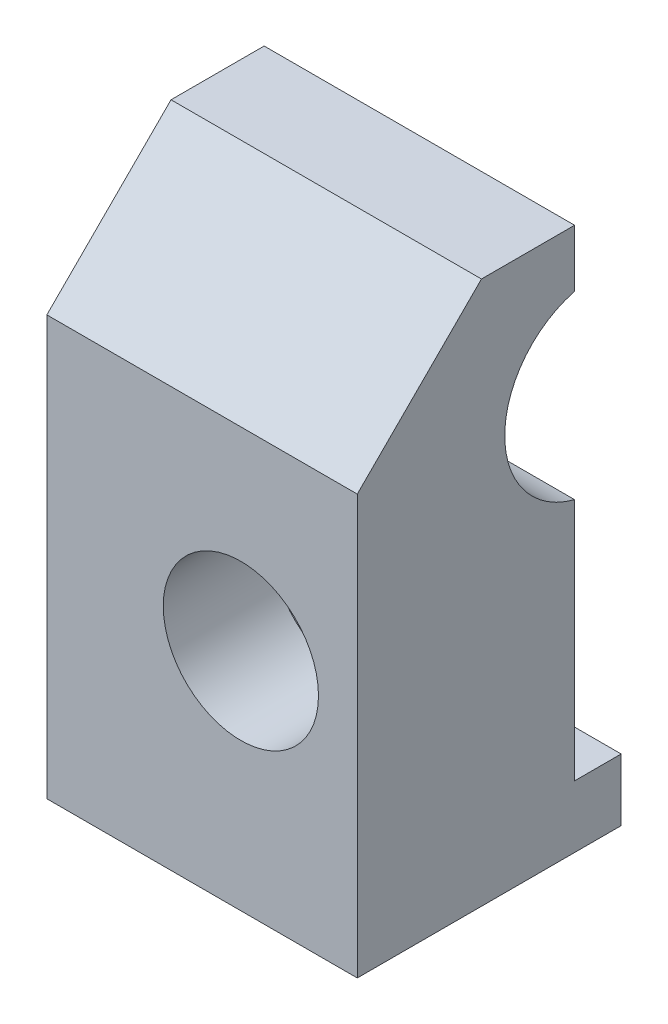
ISO-10303-21;
HEADER;
FILE_DESCRIPTION(('STEP AP214'),'2;1');
FILE_NAME('part.step','',(''),(''),'','','');
FILE_SCHEMA(('AUTOMOTIVE_DESIGN { 1 0 10303 214 1 1 1 1 }'));
ENDSEC;
DATA;
#1=APPLICATION_CONTEXT('core data for automotive mechanical design processes');
#2=APPLICATION_PROTOCOL_DEFINITION('international standard','automotive_design',2000,#1);
#3=PRODUCT_CONTEXT('',#1,'mechanical');
#4=PRODUCT('Part','Part','',(#3));
#5=PRODUCT_RELATED_PRODUCT_CATEGORY('part','',(#4));
#6=PRODUCT_DEFINITION_FORMATION('','',#4);
#7=PRODUCT_DEFINITION_CONTEXT('part definition',#1,'design');
#8=PRODUCT_DEFINITION('design','',#6,#7);
#9=PRODUCT_DEFINITION_SHAPE('','',#8);
#10=(LENGTH_UNIT() NAMED_UNIT(*) SI_UNIT(.MILLI.,.METRE.));
#11=(NAMED_UNIT(*) PLANE_ANGLE_UNIT() SI_UNIT($,.RADIAN.));
#12=(NAMED_UNIT(*) SI_UNIT($,.STERADIAN.) SOLID_ANGLE_UNIT());
#13=UNCERTAINTY_MEASURE_WITH_UNIT(LENGTH_MEASURE(1.E-05),#10,'distance_accuracy_value','');
#14=(GEOMETRIC_REPRESENTATION_CONTEXT(3) GLOBAL_UNCERTAINTY_ASSIGNED_CONTEXT((#13)) GLOBAL_UNIT_ASSIGNED_CONTEXT((#10,
#11,#12)) REPRESENTATION_CONTEXT('',''));
#15=CARTESIAN_POINT('',(0.,0.,0.));
#16=DIRECTION('',(0.,0.,1.));
#17=DIRECTION('',(1.,0.,0.));
#18=AXIS2_PLACEMENT_3D('',#15,#16,#17);
#19=CARTESIAN_POINT('',(22.5,-30.,-30.000025));
#20=DIRECTION('',(0.,0.,1.));
#21=DIRECTION('',(1.,0.,0.));
#22=AXIS2_PLACEMENT_3D('',#19,#20,#21);
#23=CYLINDRICAL_SURFACE('',#22,2.25);
#24=CARTESIAN_POINT('',(22.5,-30.,16.5));
#25=DIRECTION('',(0.,0.,-1.));
#26=DIRECTION('',(-1.,0.,0.));
#27=AXIS2_PLACEMENT_3D('',#24,#25,#26);
#28=CIRCLE('',#27,2.25);
#29=CARTESIAN_POINT('',(20.25,-30.,16.5));
#30=VERTEX_POINT('',#29);
#31=EDGE_CURVE('E139',#30,#30,#28,.T.);
#32=ORIENTED_EDGE('',*,*,#31,.T.);
#33=EDGE_LOOP('',(#32));
#34=FACE_BOUND('',#33,.T.);
#35=CARTESIAN_POINT('',(22.5,-30.,23.5));
#36=DIRECTION('',(0.,0.,1.));
#37=DIRECTION('',(1.,0.,0.));
#38=AXIS2_PLACEMENT_3D('',#35,#36,#37);
#39=CIRCLE('',#38,2.25);
#40=CARTESIAN_POINT('',(24.75,-30.,23.5));
#41=VERTEX_POINT('',#40);
#42=EDGE_CURVE('E182',#41,#41,#39,.F.);
#43=ORIENTED_EDGE('',*,*,#42,.F.);
#44=EDGE_LOOP('',(#43));
#45=FACE_BOUND('',#44,.T.);
#46=ADVANCED_FACE('F39',(#34,#45),#23,.F.);
#47=CARTESIAN_POINT('',(10.,-19.,15.));
#48=DIRECTION('',(1.,0.,0.));
#49=DIRECTION('',(0.,1.,0.));
#50=AXIS2_PLACEMENT_3D('',#47,#48,#49);
#51=CYLINDRICAL_SURFACE('',#50,6.);
#52=CARTESIAN_POINT('',(30.,-19.,15.));
#53=DIRECTION('',(-1.,0.,0.));
#54=DIRECTION('',(0.,1.,0.));
#55=AXIS2_PLACEMENT_3D('',#52,#53,#54);
#56=CIRCLE('',#55,6.);
#57=CARTESIAN_POINT('',(30.,-24.8094750193111,16.5));
#58=VERTEX_POINT('',#57);
#59=CARTESIAN_POINT('',(30.,-13.1905249806889,16.5));
#60=VERTEX_POINT('',#59);
#61=EDGE_CURVE('E155',#58,#60,#56,.T.);
#62=ORIENTED_EDGE('',*,*,#61,.F.);
#63=DIRECTION('',(1.,0.,0.));
#64=VECTOR('',#63,1.);
#65=CARTESIAN_POINT('',(10.,-24.8094750193111,16.5));
#66=LINE('',#65,#64);
#67=CARTESIAN_POINT('',(10.,-24.8094750193111,16.5));
#68=VERTEX_POINT('',#67);
#69=EDGE_CURVE('E132',#68,#58,#66,.T.);
#70=ORIENTED_EDGE('',*,*,#69,.F.);
#71=CARTESIAN_POINT('',(10.,-19.,15.));
#72=DIRECTION('',(-1.,0.,0.));
#73=DIRECTION('',(0.,1.,0.));
#74=AXIS2_PLACEMENT_3D('',#71,#72,#73);
#75=CIRCLE('',#74,6.);
#76=CARTESIAN_POINT('',(10.,-13.1905249806889,16.5));
#77=VERTEX_POINT('',#76);
#78=EDGE_CURVE('E126',#68,#77,#75,.T.);
#79=ORIENTED_EDGE('',*,*,#78,.T.);
#80=DIRECTION('',(1.,0.,0.));
#81=VECTOR('',#80,1.);
#82=CARTESIAN_POINT('',(10.,-13.1905249806889,16.5));
#83=LINE('',#82,#81);
#84=EDGE_CURVE('E108',#77,#60,#83,.T.);
#85=ORIENTED_EDGE('',*,*,#84,.T.);
#86=EDGE_LOOP('',(#62,#70,#79,#85));
#87=FACE_BOUND('',#86,.T.);
#88=ADVANCED_FACE('F131',(#87),#51,.F.);
#89=CARTESIAN_POINT('',(10.,-40.5,16.5));
#90=DIRECTION('',(0.,0.,-1.));
#91=DIRECTION('',(-1.,0.,0.));
#92=AXIS2_PLACEMENT_3D('',#89,#90,#91);
#93=PLANE('',#92);
#94=ORIENTED_EDGE('',*,*,#31,.F.);
#95=EDGE_LOOP('',(#94));
#96=FACE_BOUND('',#95,.T.);
#97=DIRECTION('',(0.,1.,0.));
#98=VECTOR('',#97,1.);
#99=CARTESIAN_POINT('',(30.,-40.5,16.5));
#100=LINE('',#99,#98);
#101=CARTESIAN_POINT('',(30.,-40.5,16.5));
#102=VERTEX_POINT('',#101);
#103=EDGE_CURVE('E133',#102,#58,#100,.T.);
#104=ORIENTED_EDGE('',*,*,#103,.F.);
#105=DIRECTION('',(1.,0.,0.));
#106=VECTOR('',#105,1.);
#107=CARTESIAN_POINT('',(10.,-40.5,16.5));
#108=LINE('',#107,#106);
#109=CARTESIAN_POINT('',(10.,-40.5,16.5));
#110=VERTEX_POINT('',#109);
#111=EDGE_CURVE('E172',#110,#102,#108,.T.);
#112=ORIENTED_EDGE('',*,*,#111,.F.);
#113=DIRECTION('',(0.,1.,0.));
#114=VECTOR('',#113,1.);
#115=CARTESIAN_POINT('',(10.,-40.5,16.5));
#116=LINE('',#115,#114);
#117=EDGE_CURVE('E119',#110,#68,#116,.T.);
#118=ORIENTED_EDGE('',*,*,#117,.T.);
#119=ORIENTED_EDGE('',*,*,#69,.T.);
#120=EDGE_LOOP('',(#104,#112,#118,#119));
#121=FACE_BOUND('',#120,.T.);
#122=ADVANCED_FACE('F198',(#96,#121),#93,.T.);
#123=CARTESIAN_POINT('',(10.,-40.5,13.5));
#124=DIRECTION('',(0.,1.,0.));
#125=DIRECTION('',(-1.,0.,0.));
#126=AXIS2_PLACEMENT_3D('',#123,#124,#125);
#127=PLANE('',#126);
#128=DIRECTION('',(0.,0.,1.));
#129=VECTOR('',#128,1.);
#130=CARTESIAN_POINT('',(30.,-40.5,13.5));
#131=LINE('',#130,#129);
#132=CARTESIAN_POINT('',(30.,-40.5,13.5));
#133=VERTEX_POINT('',#132);
#134=EDGE_CURVE('E136',#133,#102,#131,.T.);
#135=ORIENTED_EDGE('',*,*,#134,.F.);
#136=DIRECTION('',(1.,0.,0.));
#137=VECTOR('',#136,1.);
#138=CARTESIAN_POINT('',(10.,-40.5,13.5));
#139=LINE('',#138,#137);
#140=CARTESIAN_POINT('',(10.,-40.5,13.5));
#141=VERTEX_POINT('',#140);
#142=EDGE_CURVE('E174',#141,#133,#139,.T.);
#143=ORIENTED_EDGE('',*,*,#142,.F.);
#144=DIRECTION('',(0.,0.,1.));
#145=VECTOR('',#144,1.);
#146=CARTESIAN_POINT('',(10.,-40.5,13.5));
#147=LINE('',#146,#145);
#148=EDGE_CURVE('E151',#141,#110,#147,.T.);
#149=ORIENTED_EDGE('',*,*,#148,.T.);
#150=ORIENTED_EDGE('',*,*,#111,.T.);
#151=EDGE_LOOP('',(#135,#143,#149,#150));
#152=FACE_BOUND('',#151,.T.);
#153=ADVANCED_FACE('F234',(#152),#127,.T.);
#154=CARTESIAN_POINT('',(10.,-44.5,13.5));
#155=DIRECTION('',(0.,0.,-1.));
#156=DIRECTION('',(-1.,0.,0.));
#157=AXIS2_PLACEMENT_3D('',#154,#155,#156);
#158=PLANE('',#157);
#159=DIRECTION('',(0.,1.,0.));
#160=VECTOR('',#159,1.);
#161=CARTESIAN_POINT('',(30.,-44.5,13.5));
#162=LINE('',#161,#160);
#163=CARTESIAN_POINT('',(30.,-44.5,13.5));
#164=VERTEX_POINT('',#163);
#165=EDGE_CURVE('E165',#164,#133,#162,.T.);
#166=ORIENTED_EDGE('',*,*,#165,.F.);
#167=DIRECTION('',(1.,0.,0.));
#168=VECTOR('',#167,1.);
#169=CARTESIAN_POINT('',(10.,-44.5,13.5));
#170=LINE('',#169,#168);
#171=CARTESIAN_POINT('',(10.,-44.5,13.5));
#172=VERTEX_POINT('',#171);
#173=EDGE_CURVE('E176',#172,#164,#170,.T.);
#174=ORIENTED_EDGE('',*,*,#173,.F.);
#175=DIRECTION('',(0.,1.,0.));
#176=VECTOR('',#175,1.);
#177=CARTESIAN_POINT('',(10.,-44.5,13.5));
#178=LINE('',#177,#176);
#179=EDGE_CURVE('E148',#172,#141,#178,.T.);
#180=ORIENTED_EDGE('',*,*,#179,.T.);
#181=ORIENTED_EDGE('',*,*,#142,.T.);
#182=EDGE_LOOP('',(#166,#174,#180,#181));
#183=FACE_BOUND('',#182,.T.);
#184=ADVANCED_FACE('F205',(#183),#158,.T.);
#185=CARTESIAN_POINT('',(10.,-44.5,30.5));
#186=DIRECTION('',(0.,-1.,0.));
#187=DIRECTION('',(1.,0.,0.));
#188=AXIS2_PLACEMENT_3D('',#185,#186,#187);
#189=PLANE('',#188);
#190=DIRECTION('',(0.,0.,-1.));
#191=VECTOR('',#190,1.);
#192=CARTESIAN_POINT('',(30.,-44.5,30.5));
#193=LINE('',#192,#191);
#194=CARTESIAN_POINT('',(30.,-44.5,30.5));
#195=VERTEX_POINT('',#194);
#196=EDGE_CURVE('E162',#195,#164,#193,.T.);
#197=ORIENTED_EDGE('',*,*,#196,.F.);
#198=DIRECTION('',(1.,0.,0.));
#199=VECTOR('',#198,1.);
#200=CARTESIAN_POINT('',(10.,-44.5,30.5));
#201=LINE('',#200,#199);
#202=CARTESIAN_POINT('',(10.,-44.5,30.5));
#203=VERTEX_POINT('',#202);
#204=EDGE_CURVE('E178',#203,#195,#201,.T.);
#205=ORIENTED_EDGE('',*,*,#204,.F.);
#206=DIRECTION('',(0.,0.,-1.));
#207=VECTOR('',#206,1.);
#208=CARTESIAN_POINT('',(10.,-44.5,30.5));
#209=LINE('',#208,#207);
#210=EDGE_CURVE('E145',#203,#172,#209,.T.);
#211=ORIENTED_EDGE('',*,*,#210,.T.);
#212=ORIENTED_EDGE('',*,*,#173,.T.);
#213=EDGE_LOOP('',(#197,#205,#211,#212));
#214=FACE_BOUND('',#213,.T.);
#215=ADVANCED_FACE('F208',(#214),#189,.T.);
#216=CARTESIAN_POINT('',(10.,-9.5,30.5));
#217=DIRECTION('',(0.,0.,1.));
#218=DIRECTION('',(0.,-1.,0.));
#219=AXIS2_PLACEMENT_3D('',#216,#217,#218);
#220=PLANE('',#219);
#221=CARTESIAN_POINT('',(22.5,-30.,30.5));
#222=DIRECTION('',(0.,0.,1.));
#223=DIRECTION('',(1.,0.,0.));
#224=AXIS2_PLACEMENT_3D('',#221,#222,#223);
#225=CIRCLE('',#224,5.);
#226=CARTESIAN_POINT('',(27.5,-30.,30.5));
#227=VERTEX_POINT('',#226);
#228=EDGE_CURVE('E335',#227,#227,#225,.T.);
#229=ORIENTED_EDGE('',*,*,#228,.F.);
#230=EDGE_LOOP('',(#229));
#231=FACE_BOUND('',#230,.T.);
#232=DIRECTION('',(0.,-1.,0.));
#233=VECTOR('',#232,1.);
#234=CARTESIAN_POINT('',(30.,-9.5,30.5));
#235=LINE('',#234,#233);
#236=CARTESIAN_POINT('',(30.,-17.5,30.5));
#237=VERTEX_POINT('',#236);
#238=EDGE_CURVE('E160',#237,#195,#235,.T.);
#239=ORIENTED_EDGE('',*,*,#238,.F.);
#240=DIRECTION('',(-1.,0.,0.));
#241=VECTOR('',#240,1.);
#242=CARTESIAN_POINT('',(10.,-17.5,30.5));
#243=LINE('',#242,#241);
#244=CARTESIAN_POINT('',(10.,-17.5,30.5));
#245=VERTEX_POINT('',#244);
#246=EDGE_CURVE('E47',#237,#245,#243,.T.);
#247=ORIENTED_EDGE('',*,*,#246,.T.);
#248=DIRECTION('',(0.,-1.,0.));
#249=VECTOR('',#248,1.);
#250=CARTESIAN_POINT('',(10.,-9.5,30.5));
#251=LINE('',#250,#249);
#252=EDGE_CURVE('E143',#245,#203,#251,.T.);
#253=ORIENTED_EDGE('',*,*,#252,.T.);
#254=ORIENTED_EDGE('',*,*,#204,.T.);
#255=EDGE_LOOP('',(#239,#247,#253,#254));
#256=FACE_BOUND('',#255,.T.);
#257=ADVANCED_FACE('F242',(#231,#256),#220,.T.);
#258=CARTESIAN_POINT('',(10.,-9.5,16.5));
#259=DIRECTION('',(0.,1.,0.));
#260=DIRECTION('',(-1.,0.,0.));
#261=AXIS2_PLACEMENT_3D('',#258,#259,#260);
#262=PLANE('',#261);
#263=DIRECTION('',(0.,0.,1.));
#264=VECTOR('',#263,1.);
#265=CARTESIAN_POINT('',(10.,-9.5,16.5));
#266=LINE('',#265,#264);
#267=CARTESIAN_POINT('',(10.,-9.5,16.5));
#268=VERTEX_POINT('',#267);
#269=CARTESIAN_POINT('',(10.,-9.5,22.5));
#270=VERTEX_POINT('',#269);
#271=EDGE_CURVE('E129',#268,#270,#266,.T.);
#272=ORIENTED_EDGE('',*,*,#271,.T.);
#273=DIRECTION('',(1.,0.,0.));
#274=VECTOR('',#273,1.);
#275=CARTESIAN_POINT('',(10.,-9.5,22.5));
#276=LINE('',#275,#274);
#277=CARTESIAN_POINT('',(30.,-9.5,22.5));
#278=VERTEX_POINT('',#277);
#279=EDGE_CURVE('E171',#270,#278,#276,.T.);
#280=ORIENTED_EDGE('',*,*,#279,.T.);
#281=DIRECTION('',(0.,0.,1.));
#282=VECTOR('',#281,1.);
#283=CARTESIAN_POINT('',(30.,-9.5,16.5));
#284=LINE('',#283,#282);
#285=CARTESIAN_POINT('',(30.,-9.5,16.5));
#286=VERTEX_POINT('',#285);
#287=EDGE_CURVE('E158',#286,#278,#284,.T.);
#288=ORIENTED_EDGE('',*,*,#287,.F.);
#289=DIRECTION('',(1.,0.,0.));
#290=VECTOR('',#289,1.);
#291=CARTESIAN_POINT('',(10.,-9.5,16.5));
#292=LINE('',#291,#290);
#293=EDGE_CURVE('E118',#268,#286,#292,.T.);
#294=ORIENTED_EDGE('',*,*,#293,.F.);
#295=EDGE_LOOP('',(#272,#280,#288,#294));
#296=FACE_BOUND('',#295,.T.);
#297=ADVANCED_FACE('F191',(#296),#262,.T.);
#298=CARTESIAN_POINT('',(10.,-13.1905249806889,16.5));
#299=DIRECTION('',(0.,0.,-1.));
#300=DIRECTION('',(-1.,0.,0.));
#301=AXIS2_PLACEMENT_3D('',#298,#299,#300);
#302=PLANE('',#301);
#303=DIRECTION('',(0.,1.,0.));
#304=VECTOR('',#303,1.);
#305=CARTESIAN_POINT('',(30.,-13.1905249806889,16.5));
#306=LINE('',#305,#304);
#307=EDGE_CURVE('E113',#60,#286,#306,.T.);
#308=ORIENTED_EDGE('',*,*,#307,.F.);
#309=ORIENTED_EDGE('',*,*,#84,.F.);
#310=DIRECTION('',(0.,1.,0.));
#311=VECTOR('',#310,1.);
#312=CARTESIAN_POINT('',(10.,-13.1905249806889,16.5));
#313=LINE('',#312,#311);
#314=EDGE_CURVE('E111',#77,#268,#313,.T.);
#315=ORIENTED_EDGE('',*,*,#314,.T.);
#316=ORIENTED_EDGE('',*,*,#293,.T.);
#317=EDGE_LOOP('',(#308,#309,#315,#316));
#318=FACE_BOUND('',#317,.T.);
#319=ADVANCED_FACE('F110',(#318),#302,.T.);
#320=CARTESIAN_POINT('',(10.,-19.,15.));
#321=DIRECTION('',(1.,0.,0.));
#322=DIRECTION('',(0.,1.,0.));
#323=AXIS2_PLACEMENT_3D('',#320,#321,#322);
#324=PLANE('',#323);
#325=ORIENTED_EDGE('',*,*,#252,.F.);
#326=DIRECTION('',(0.,-0.707106781186549,0.707106781186546));
#327=VECTOR('',#326,1.);
#328=CARTESIAN_POINT('',(10.,-9.5,22.5));
#329=LINE('',#328,#327);
#330=EDGE_CURVE('E12',#245,#270,#329,.F.);
#331=ORIENTED_EDGE('',*,*,#330,.T.);
#332=ORIENTED_EDGE('',*,*,#271,.F.);
#333=ORIENTED_EDGE('',*,*,#314,.F.);
#334=ORIENTED_EDGE('',*,*,#78,.F.);
#335=ORIENTED_EDGE('',*,*,#117,.F.);
#336=ORIENTED_EDGE('',*,*,#148,.F.);
#337=ORIENTED_EDGE('',*,*,#179,.F.);
#338=ORIENTED_EDGE('',*,*,#210,.F.);
#339=EDGE_LOOP('',(#325,#331,#332,#333,#334,#335,#336,#337,#338));
#340=FACE_BOUND('',#339,.T.);
#341=ADVANCED_FACE('F124',(#340),#324,.F.);
#342=CARTESIAN_POINT('',(30.,-19.,15.));
#343=DIRECTION('',(1.,0.,0.));
#344=DIRECTION('',(0.,1.,0.));
#345=AXIS2_PLACEMENT_3D('',#342,#343,#344);
#346=PLANE('',#345);
#347=ORIENTED_EDGE('',*,*,#287,.T.);
#348=DIRECTION('',(0.,0.707106781186549,-0.707106781186546));
#349=VECTOR('',#348,1.);
#350=CARTESIAN_POINT('',(30.,-10.5,23.5));
#351=LINE('',#350,#349);
#352=EDGE_CURVE('E61',#278,#237,#351,.F.);
#353=ORIENTED_EDGE('',*,*,#352,.T.);
#354=ORIENTED_EDGE('',*,*,#238,.T.);
#355=ORIENTED_EDGE('',*,*,#196,.T.);
#356=ORIENTED_EDGE('',*,*,#165,.T.);
#357=ORIENTED_EDGE('',*,*,#134,.T.);
#358=ORIENTED_EDGE('',*,*,#103,.T.);
#359=ORIENTED_EDGE('',*,*,#61,.T.);
#360=ORIENTED_EDGE('',*,*,#307,.T.);
#361=EDGE_LOOP('',(#347,#353,#354,#355,#356,#357,#358,#359,#360));
#362=FACE_BOUND('',#361,.T.);
#363=ADVANCED_FACE('F194',(#362),#346,.T.);
#364=CARTESIAN_POINT('',(22.5,-30.,23.5));
#365=DIRECTION('',(0.,0.,1.));
#366=DIRECTION('',(1.,0.,0.));
#367=AXIS2_PLACEMENT_3D('',#364,#365,#366);
#368=PLANE('',#367);
#369=CARTESIAN_POINT('',(22.5,-30.,23.5));
#370=DIRECTION('',(0.,0.,1.));
#371=DIRECTION('',(1.,0.,0.));
#372=AXIS2_PLACEMENT_3D('',#369,#370,#371);
#373=CIRCLE('',#372,5.);
#374=CARTESIAN_POINT('',(27.5,-30.,23.5));
#375=VERTEX_POINT('',#374);
#376=EDGE_CURVE('E185',#375,#375,#373,.T.);
#377=ORIENTED_EDGE('',*,*,#376,.T.);
#378=EDGE_LOOP('',(#377));
#379=FACE_BOUND('',#378,.T.);
#380=ORIENTED_EDGE('',*,*,#42,.T.);
#381=EDGE_LOOP('',(#380));
#382=FACE_BOUND('',#381,.T.);
#383=ADVANCED_FACE('F215',(#379,#382),#368,.T.);
#384=CARTESIAN_POINT('',(22.5,-30.,23.5));
#385=DIRECTION('',(0.,0.,1.));
#386=DIRECTION('',(1.,0.,0.));
#387=AXIS2_PLACEMENT_3D('',#384,#385,#386);
#388=CYLINDRICAL_SURFACE('',#387,5.);
#389=ORIENTED_EDGE('',*,*,#376,.F.);
#390=EDGE_LOOP('',(#389));
#391=FACE_BOUND('',#390,.T.);
#392=ORIENTED_EDGE('',*,*,#228,.T.);
#393=EDGE_LOOP('',(#392));
#394=FACE_BOUND('',#393,.T.);
#395=ADVANCED_FACE('F211',(#391,#394),#388,.F.);
#396=CARTESIAN_POINT('',(10.,-9.5,22.5));
#397=DIRECTION('',(0.,-0.707106781186546,-0.707106781186549));
#398=DIRECTION('',(1.,0.,0.));
#399=AXIS2_PLACEMENT_3D('',#396,#397,#398);
#400=PLANE('',#399);
#401=ORIENTED_EDGE('',*,*,#330,.F.);
#402=ORIENTED_EDGE('',*,*,#246,.F.);
#403=ORIENTED_EDGE('',*,*,#352,.F.);
#404=ORIENTED_EDGE('',*,*,#279,.F.);
#405=EDGE_LOOP('',(#401,#402,#403,#404));
#406=FACE_BOUND('',#405,.T.);
#407=ADVANCED_FACE('F41',(#406),#400,.F.);
#408=CLOSED_SHELL('',(#46,#88,#122,#153,#184,#215,#257,#297,#319,#341,#363,#383,#395,#407));
#409=MANIFOLD_SOLID_BREP('B2',#408);
#410=ADVANCED_BREP_SHAPE_REPRESENTATION('',(#18,#409),#14);
#411=SHAPE_DEFINITION_REPRESENTATION(#9,#410);
ENDSEC;
END-ISO-10303-21;
